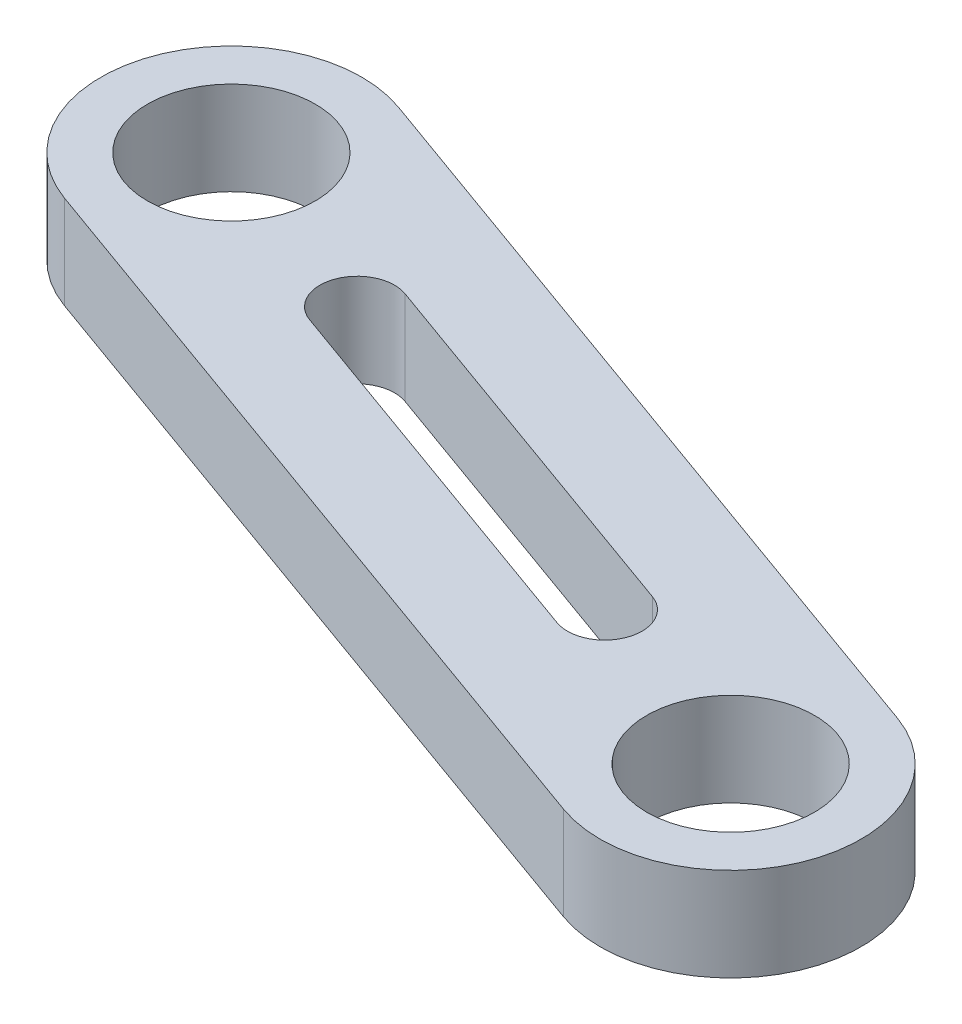
ISO-10303-21;
HEADER;
FILE_DESCRIPTION(('STEP AP214'),'2;1');
FILE_NAME('part.step','',(''),(''),'','','');
FILE_SCHEMA(('AUTOMOTIVE_DESIGN { 1 0 10303 214 1 1 1 1 }'));
ENDSEC;
DATA;
#1=APPLICATION_CONTEXT('core data for automotive mechanical design processes');
#2=APPLICATION_PROTOCOL_DEFINITION('international standard','automotive_design',2000,#1);
#3=PRODUCT_CONTEXT('',#1,'mechanical');
#4=PRODUCT('Part','Part','',(#3));
#5=PRODUCT_RELATED_PRODUCT_CATEGORY('part','',(#4));
#6=PRODUCT_DEFINITION_FORMATION('','',#4);
#7=PRODUCT_DEFINITION_CONTEXT('part definition',#1,'design');
#8=PRODUCT_DEFINITION('design','',#6,#7);
#9=PRODUCT_DEFINITION_SHAPE('','',#8);
#10=(LENGTH_UNIT() NAMED_UNIT(*) SI_UNIT(.MILLI.,.METRE.));
#11=(NAMED_UNIT(*) PLANE_ANGLE_UNIT() SI_UNIT($,.RADIAN.));
#12=(NAMED_UNIT(*) SI_UNIT($,.STERADIAN.) SOLID_ANGLE_UNIT());
#13=UNCERTAINTY_MEASURE_WITH_UNIT(LENGTH_MEASURE(1.E-05),#10,'distance_accuracy_value','');
#14=(GEOMETRIC_REPRESENTATION_CONTEXT(3) GLOBAL_UNCERTAINTY_ASSIGNED_CONTEXT((#13)) GLOBAL_UNIT_ASSIGNED_CONTEXT((#10,
#11,#12)) REPRESENTATION_CONTEXT('',''));
#15=CARTESIAN_POINT('',(0.,0.,0.));
#16=DIRECTION('',(0.,0.,1.));
#17=DIRECTION('',(1.,0.,0.));
#18=AXIS2_PLACEMENT_3D('',#15,#16,#17);
#19=CARTESIAN_POINT('',(-41.7689300556869,5.,100.));
#20=DIRECTION('',(0.,1.,0.));
#21=DIRECTION('',(0.,0.,1.));
#22=AXIS2_PLACEMENT_3D('',#19,#20,#21);
#23=PLANE('',#22);
#24=CARTESIAN_POINT('',(-31.2371314393114,5.,103.782164853996));
#25=DIRECTION('',(0.,1.,0.));
#26=DIRECTION('',(0.,0.,1.));
#27=AXIS2_PLACEMENT_3D('',#24,#25,#26);
#28=CIRCLE('',#27,1.99999999999999);
#29=CARTESIAN_POINT('',(-30.5611614127652,5.,101.899861870093));
#30=VERTEX_POINT('',#29);
#31=CARTESIAN_POINT('',(-31.9131014658576,5.,105.664467837899));
#32=VERTEX_POINT('',#31);
#33=EDGE_CURVE('E51',#30,#32,#28,.T.);
#34=ORIENTED_EDGE('',*,*,#33,.F.);
#35=DIRECTION('',(-0.941151491951632,0.,-0.337985013273099));
#36=VECTOR('',#35,1.);
#37=CARTESIAN_POINT('',(-30.5611614127652,5.,101.899861870093));
#38=LINE('',#37,#36);
#39=CARTESIAN_POINT('',(-9.85582858982932,5.,109.335532162101));
#40=VERTEX_POINT('',#39);
#41=EDGE_CURVE('E119',#40,#30,#38,.T.);
#42=ORIENTED_EDGE('',*,*,#41,.F.);
#43=CARTESIAN_POINT('',(-10.5317986163755,5.,111.217835146004));
#44=DIRECTION('',(0.,1.,0.));
#45=DIRECTION('',(0.,0.,1.));
#46=AXIS2_PLACEMENT_3D('',#43,#44,#45);
#47=CIRCLE('',#46,1.99999999999999);
#48=CARTESIAN_POINT('',(-11.2077686429217,5.,113.100138129907));
#49=VERTEX_POINT('',#48);
#50=EDGE_CURVE('E104',#49,#40,#47,.T.);
#51=ORIENTED_EDGE('',*,*,#50,.F.);
#52=DIRECTION('',(0.941151491951632,0.,0.337985013273099));
#53=VECTOR('',#52,1.);
#54=CARTESIAN_POINT('',(-31.9131014658576,5.,105.664467837899));
#55=LINE('',#54,#53);
#56=EDGE_CURVE('E113',#32,#49,#55,.T.);
#57=ORIENTED_EDGE('',*,*,#56,.F.);
#58=EDGE_LOOP('',(#34,#42,#51,#57));
#59=FACE_BOUND('',#58,.T.);
#60=CARTESIAN_POINT('',(-41.7689300556869,5.,100.));
#61=DIRECTION('',(0.,1.,0.));
#62=DIRECTION('',(0.,0.,1.));
#63=AXIS2_PLACEMENT_3D('',#60,#61,#62);
#64=CIRCLE('',#63,4.5);
#65=CARTESIAN_POINT('',(-41.7689300556869,5.,104.5));
#66=VERTEX_POINT('',#65);
#67=EDGE_CURVE('E135',#66,#66,#64,.T.);
#68=ORIENTED_EDGE('',*,*,#67,.F.);
#69=EDGE_LOOP('',(#68));
#70=FACE_BOUND('',#69,.T.);
#71=CARTESIAN_POINT('',(-41.7689300556869,5.,100.));
#72=DIRECTION('',(0.,1.,0.));
#73=DIRECTION('',(0.,0.,1.));
#74=AXIS2_PLACEMENT_3D('',#71,#72,#73);
#75=CIRCLE('',#74,6.99999999999999);
#76=CARTESIAN_POINT('',(-39.4030349627752,5.,93.4119395563386));
#77=VERTEX_POINT('',#76);
#78=CARTESIAN_POINT('',(-44.1348251485986,5.,106.588060443661));
#79=VERTEX_POINT('',#78);
#80=EDGE_CURVE('E141',#77,#79,#75,.T.);
#81=ORIENTED_EDGE('',*,*,#80,.T.);
#82=DIRECTION('',(0.941151491951632,0.,0.337985013273099));
#83=VECTOR('',#82,1.);
#84=CARTESIAN_POINT('',(-44.1348251485986,5.,106.588060443661));
#85=LINE('',#84,#83);
#86=CARTESIAN_POINT('',(-2.3658950929117,5.,121.588060443661));
#87=VERTEX_POINT('',#86);
#88=EDGE_CURVE('E144',#79,#87,#85,.T.);
#89=ORIENTED_EDGE('',*,*,#88,.T.);
#90=CARTESIAN_POINT('',(0.,5.,115.));
#91=DIRECTION('',(0.,1.,0.));
#92=DIRECTION('',(0.,0.,1.));
#93=AXIS2_PLACEMENT_3D('',#90,#91,#92);
#94=CIRCLE('',#93,7.00000000000001);
#95=CARTESIAN_POINT('',(2.36589509291169,5.,108.411939556339));
#96=VERTEX_POINT('',#95);
#97=EDGE_CURVE('E147',#87,#96,#94,.T.);
#98=ORIENTED_EDGE('',*,*,#97,.T.);
#99=DIRECTION('',(-0.941151491951632,0.,-0.337985013273099));
#100=VECTOR('',#99,1.);
#101=CARTESIAN_POINT('',(-39.4030349627752,5.,93.4119395563386));
#102=LINE('',#101,#100);
#103=EDGE_CURVE('E149',#96,#77,#102,.T.);
#104=ORIENTED_EDGE('',*,*,#103,.T.);
#105=EDGE_LOOP('',(#81,#89,#98,#104));
#106=FACE_BOUND('',#105,.T.);
#107=CARTESIAN_POINT('',(0.,5.,115.));
#108=DIRECTION('',(0.,1.,0.));
#109=DIRECTION('',(0.,0.,1.));
#110=AXIS2_PLACEMENT_3D('',#107,#108,#109);
#111=CIRCLE('',#110,4.5);
#112=CARTESIAN_POINT('',(0.,5.,119.5));
#113=VERTEX_POINT('',#112);
#114=EDGE_CURVE('E129',#113,#113,#111,.T.);
#115=ORIENTED_EDGE('',*,*,#114,.F.);
#116=EDGE_LOOP('',(#115));
#117=FACE_BOUND('',#116,.T.);
#118=ADVANCED_FACE('F36',(#59,#70,#106,#117),#23,.T.);
#119=CARTESIAN_POINT('',(-41.7689300556869,0.,100.));
#120=DIRECTION('',(0.,1.,0.));
#121=DIRECTION('',(0.,0.,1.));
#122=AXIS2_PLACEMENT_3D('',#119,#120,#121);
#123=PLANE('',#122);
#124=DIRECTION('',(-0.941151491951632,0.,-0.337985013273099));
#125=VECTOR('',#124,1.);
#126=CARTESIAN_POINT('',(-41.0929600291407,0.,98.1176970160967));
#127=LINE('',#126,#125);
#128=CARTESIAN_POINT('',(-9.85582858982932,0.,109.335532162101));
#129=VERTEX_POINT('',#128);
#130=CARTESIAN_POINT('',(-30.5611614127652,0.,101.899861870093));
#131=VERTEX_POINT('',#130);
#132=EDGE_CURVE('E44',#129,#131,#127,.T.);
#133=ORIENTED_EDGE('',*,*,#132,.T.);
#134=CARTESIAN_POINT('',(-31.2371314393114,0.,103.782164853996));
#135=DIRECTION('',(0.,1.,0.));
#136=DIRECTION('',(0.,0.,1.));
#137=AXIS2_PLACEMENT_3D('',#134,#135,#136);
#138=CIRCLE('',#137,1.99999999999999);
#139=CARTESIAN_POINT('',(-31.9131014658576,0.,105.664467837899));
#140=VERTEX_POINT('',#139);
#141=EDGE_CURVE('E11',#131,#140,#138,.T.);
#142=ORIENTED_EDGE('',*,*,#141,.T.);
#143=DIRECTION('',(0.941151491951632,0.,0.337985013273099));
#144=VECTOR('',#143,1.);
#145=CARTESIAN_POINT('',(-42.4449000822331,0.,101.882302983903));
#146=LINE('',#145,#144);
#147=CARTESIAN_POINT('',(-11.2077686429217,0.,113.100138129907));
#148=VERTEX_POINT('',#147);
#149=EDGE_CURVE('E170',#140,#148,#146,.T.);
#150=ORIENTED_EDGE('',*,*,#149,.T.);
#151=CARTESIAN_POINT('',(-10.5317986163755,0.,111.217835146004));
#152=DIRECTION('',(0.,1.,0.));
#153=DIRECTION('',(0.,0.,1.));
#154=AXIS2_PLACEMENT_3D('',#151,#152,#153);
#155=CIRCLE('',#154,1.99999999999999);
#156=EDGE_CURVE('E107',#148,#129,#155,.T.);
#157=ORIENTED_EDGE('',*,*,#156,.T.);
#158=EDGE_LOOP('',(#133,#142,#150,#157));
#159=FACE_BOUND('',#158,.T.);
#160=CARTESIAN_POINT('',(-41.7689300556869,0.,100.));
#161=DIRECTION('',(0.,1.,0.));
#162=DIRECTION('',(0.,0.,1.));
#163=AXIS2_PLACEMENT_3D('',#160,#161,#162);
#164=CIRCLE('',#163,6.99999999999999);
#165=CARTESIAN_POINT('',(-39.4030349627752,0.,93.4119395563386));
#166=VERTEX_POINT('',#165);
#167=CARTESIAN_POINT('',(-44.1348251485986,0.,106.588060443661));
#168=VERTEX_POINT('',#167);
#169=EDGE_CURVE('E138',#166,#168,#164,.T.);
#170=ORIENTED_EDGE('',*,*,#169,.F.);
#171=DIRECTION('',(-0.941151491951632,0.,-0.337985013273099));
#172=VECTOR('',#171,1.);
#173=CARTESIAN_POINT('',(-39.4030349627752,0.,93.4119395563386));
#174=LINE('',#173,#172);
#175=CARTESIAN_POINT('',(2.36589509291169,0.,108.411939556339));
#176=VERTEX_POINT('',#175);
#177=EDGE_CURVE('E145',#176,#166,#174,.T.);
#178=ORIENTED_EDGE('',*,*,#177,.F.);
#179=CARTESIAN_POINT('',(0.,0.,115.));
#180=DIRECTION('',(0.,1.,0.));
#181=DIRECTION('',(0.,0.,1.));
#182=AXIS2_PLACEMENT_3D('',#179,#180,#181);
#183=CIRCLE('',#182,7.00000000000001);
#184=CARTESIAN_POINT('',(-2.3658950929117,0.,121.588060443661));
#185=VERTEX_POINT('',#184);
#186=EDGE_CURVE('E156',#185,#176,#183,.T.);
#187=ORIENTED_EDGE('',*,*,#186,.F.);
#188=DIRECTION('',(0.941151491951632,0.,0.337985013273099));
#189=VECTOR('',#188,1.);
#190=CARTESIAN_POINT('',(-44.1348251485986,0.,106.588060443661));
#191=LINE('',#190,#189);
#192=EDGE_CURVE('E154',#168,#185,#191,.T.);
#193=ORIENTED_EDGE('',*,*,#192,.F.);
#194=EDGE_LOOP('',(#170,#178,#187,#193));
#195=FACE_BOUND('',#194,.T.);
#196=CARTESIAN_POINT('',(-41.7689300556869,0.,100.));
#197=DIRECTION('',(0.,1.,0.));
#198=DIRECTION('',(0.,0.,1.));
#199=AXIS2_PLACEMENT_3D('',#196,#197,#198);
#200=CIRCLE('',#199,4.5);
#201=CARTESIAN_POINT('',(-41.7689300556869,0.,104.5));
#202=VERTEX_POINT('',#201);
#203=EDGE_CURVE('E132',#202,#202,#200,.T.);
#204=ORIENTED_EDGE('',*,*,#203,.T.);
#205=EDGE_LOOP('',(#204));
#206=FACE_BOUND('',#205,.T.);
#207=CARTESIAN_POINT('',(0.,0.,115.));
#208=DIRECTION('',(0.,1.,0.));
#209=DIRECTION('',(0.,0.,1.));
#210=AXIS2_PLACEMENT_3D('',#207,#208,#209);
#211=CIRCLE('',#210,4.5);
#212=CARTESIAN_POINT('',(0.,0.,119.5));
#213=VERTEX_POINT('',#212);
#214=EDGE_CURVE('E126',#213,#213,#211,.T.);
#215=ORIENTED_EDGE('',*,*,#214,.T.);
#216=EDGE_LOOP('',(#215));
#217=FACE_BOUND('',#216,.T.);
#218=ADVANCED_FACE('F174',(#159,#195,#206,#217),#123,.F.);
#219=CARTESIAN_POINT('',(-41.7689300556869,5.,100.));
#220=DIRECTION('',(0.,-1.,0.));
#221=DIRECTION('',(0.,0.,-1.));
#222=AXIS2_PLACEMENT_3D('',#219,#220,#221);
#223=CYLINDRICAL_SURFACE('',#222,6.99999999999999);
#224=ORIENTED_EDGE('',*,*,#169,.T.);
#225=DIRECTION('',(0.,-1.,0.));
#226=VECTOR('',#225,1.);
#227=CARTESIAN_POINT('',(-44.1348251485986,5.,106.588060443661));
#228=LINE('',#227,#226);
#229=EDGE_CURVE('E167',#79,#168,#228,.T.);
#230=ORIENTED_EDGE('',*,*,#229,.F.);
#231=ORIENTED_EDGE('',*,*,#80,.F.);
#232=DIRECTION('',(0.,-1.,0.));
#233=VECTOR('',#232,1.);
#234=CARTESIAN_POINT('',(-39.4030349627752,5.,93.4119395563386));
#235=LINE('',#234,#233);
#236=EDGE_CURVE('E151',#77,#166,#235,.T.);
#237=ORIENTED_EDGE('',*,*,#236,.T.);
#238=EDGE_LOOP('',(#224,#230,#231,#237));
#239=FACE_BOUND('',#238,.T.);
#240=ADVANCED_FACE('F38',(#239),#223,.T.);
#241=CARTESIAN_POINT('',(-44.1348251485986,5.,106.588060443661));
#242=DIRECTION('',(0.337985013273099,0.,-0.941151491951632));
#243=DIRECTION('',(-0.941151491951632,0.,-0.337985013273099));
#244=AXIS2_PLACEMENT_3D('',#241,#242,#243);
#245=PLANE('',#244);
#246=ORIENTED_EDGE('',*,*,#192,.T.);
#247=DIRECTION('',(0.,-1.,0.));
#248=VECTOR('',#247,1.);
#249=CARTESIAN_POINT('',(-2.3658950929117,5.,121.588060443661));
#250=LINE('',#249,#248);
#251=EDGE_CURVE('E164',#87,#185,#250,.T.);
#252=ORIENTED_EDGE('',*,*,#251,.F.);
#253=ORIENTED_EDGE('',*,*,#88,.F.);
#254=ORIENTED_EDGE('',*,*,#229,.T.);
#255=EDGE_LOOP('',(#246,#252,#253,#254));
#256=FACE_BOUND('',#255,.T.);
#257=ADVANCED_FACE('F206',(#256),#245,.F.);
#258=CARTESIAN_POINT('',(0.,5.,115.));
#259=DIRECTION('',(0.,-1.,0.));
#260=DIRECTION('',(0.,0.,-1.));
#261=AXIS2_PLACEMENT_3D('',#258,#259,#260);
#262=CYLINDRICAL_SURFACE('',#261,7.00000000000001);
#263=ORIENTED_EDGE('',*,*,#186,.T.);
#264=DIRECTION('',(0.,-1.,0.));
#265=VECTOR('',#264,1.);
#266=CARTESIAN_POINT('',(2.36589509291169,5.,108.411939556339));
#267=LINE('',#266,#265);
#268=EDGE_CURVE('E161',#96,#176,#267,.T.);
#269=ORIENTED_EDGE('',*,*,#268,.F.);
#270=ORIENTED_EDGE('',*,*,#97,.F.);
#271=ORIENTED_EDGE('',*,*,#251,.T.);
#272=EDGE_LOOP('',(#263,#269,#270,#271));
#273=FACE_BOUND('',#272,.T.);
#274=ADVANCED_FACE('F203',(#273),#262,.T.);
#275=CARTESIAN_POINT('',(-39.4030349627752,5.,93.4119395563386));
#276=DIRECTION('',(-0.337985013273099,0.,0.941151491951632));
#277=DIRECTION('',(0.941151491951632,0.,0.337985013273099));
#278=AXIS2_PLACEMENT_3D('',#275,#276,#277);
#279=PLANE('',#278);
#280=ORIENTED_EDGE('',*,*,#177,.T.);
#281=ORIENTED_EDGE('',*,*,#236,.F.);
#282=ORIENTED_EDGE('',*,*,#103,.F.);
#283=ORIENTED_EDGE('',*,*,#268,.T.);
#284=EDGE_LOOP('',(#280,#281,#282,#283));
#285=FACE_BOUND('',#284,.T.);
#286=ADVANCED_FACE('F200',(#285),#279,.F.);
#287=CARTESIAN_POINT('',(-41.7689300556869,5.,100.));
#288=DIRECTION('',(0.,-1.,0.));
#289=DIRECTION('',(0.,0.,-1.));
#290=AXIS2_PLACEMENT_3D('',#287,#288,#289);
#291=CYLINDRICAL_SURFACE('',#290,4.5);
#292=ORIENTED_EDGE('',*,*,#67,.T.);
#293=EDGE_LOOP('',(#292));
#294=FACE_BOUND('',#293,.T.);
#295=ORIENTED_EDGE('',*,*,#203,.F.);
#296=EDGE_LOOP('',(#295));
#297=FACE_BOUND('',#296,.T.);
#298=ADVANCED_FACE('F188',(#294,#297),#291,.F.);
#299=CARTESIAN_POINT('',(0.,5.,115.));
#300=DIRECTION('',(0.,-1.,0.));
#301=DIRECTION('',(0.,0.,-1.));
#302=AXIS2_PLACEMENT_3D('',#299,#300,#301);
#303=CYLINDRICAL_SURFACE('',#302,4.5);
#304=ORIENTED_EDGE('',*,*,#114,.T.);
#305=EDGE_LOOP('',(#304));
#306=FACE_BOUND('',#305,.T.);
#307=ORIENTED_EDGE('',*,*,#214,.F.);
#308=EDGE_LOOP('',(#307));
#309=FACE_BOUND('',#308,.T.);
#310=ADVANCED_FACE('F181',(#306,#309),#303,.F.);
#311=CARTESIAN_POINT('',(-31.2371314393114,-5.,103.782164853996));
#312=DIRECTION('',(0.,1.,0.));
#313=DIRECTION('',(0.,0.,1.));
#314=AXIS2_PLACEMENT_3D('',#311,#312,#313);
#315=CYLINDRICAL_SURFACE('',#314,1.99999999999999);
#316=DIRECTION('',(0.,1.,0.));
#317=VECTOR('',#316,1.);
#318=CARTESIAN_POINT('',(-30.5611614127652,-5.,101.899861870093));
#319=LINE('',#318,#317);
#320=EDGE_CURVE('E124',#131,#30,#319,.T.);
#321=ORIENTED_EDGE('',*,*,#320,.T.);
#322=ORIENTED_EDGE('',*,*,#33,.T.);
#323=DIRECTION('',(0.,1.,0.));
#324=VECTOR('',#323,1.);
#325=CARTESIAN_POINT('',(-31.9131014658576,-5.,105.664467837899));
#326=LINE('',#325,#324);
#327=EDGE_CURVE('E110',#140,#32,#326,.T.);
#328=ORIENTED_EDGE('',*,*,#327,.F.);
#329=ORIENTED_EDGE('',*,*,#141,.F.);
#330=EDGE_LOOP('',(#321,#322,#328,#329));
#331=FACE_BOUND('',#330,.T.);
#332=ADVANCED_FACE('F179',(#331),#315,.F.);
#333=CARTESIAN_POINT('',(-30.5611614127652,-5.,101.899861870093));
#334=DIRECTION('',(0.337985013273099,0.,-0.941151491951632));
#335=DIRECTION('',(-0.941151491951632,0.,-0.337985013273099));
#336=AXIS2_PLACEMENT_3D('',#333,#334,#335);
#337=PLANE('',#336);
#338=DIRECTION('',(0.,1.,0.));
#339=VECTOR('',#338,1.);
#340=CARTESIAN_POINT('',(-9.85582858982932,-5.,109.335532162101));
#341=LINE('',#340,#339);
#342=EDGE_CURVE('E109',#129,#40,#341,.T.);
#343=ORIENTED_EDGE('',*,*,#342,.T.);
#344=ORIENTED_EDGE('',*,*,#41,.T.);
#345=ORIENTED_EDGE('',*,*,#320,.F.);
#346=ORIENTED_EDGE('',*,*,#132,.F.);
#347=EDGE_LOOP('',(#343,#344,#345,#346));
#348=FACE_BOUND('',#347,.T.);
#349=ADVANCED_FACE('F178',(#348),#337,.F.);
#350=CARTESIAN_POINT('',(-10.5317986163755,-5.,111.217835146004));
#351=DIRECTION('',(0.,1.,0.));
#352=DIRECTION('',(0.,0.,1.));
#353=AXIS2_PLACEMENT_3D('',#350,#351,#352);
#354=CYLINDRICAL_SURFACE('',#353,1.99999999999999);
#355=DIRECTION('',(0.,1.,0.));
#356=VECTOR('',#355,1.);
#357=CARTESIAN_POINT('',(-11.2077686429217,-5.,113.100138129907));
#358=LINE('',#357,#356);
#359=EDGE_CURVE('E59',#148,#49,#358,.T.);
#360=ORIENTED_EDGE('',*,*,#359,.T.);
#361=ORIENTED_EDGE('',*,*,#50,.T.);
#362=ORIENTED_EDGE('',*,*,#342,.F.);
#363=ORIENTED_EDGE('',*,*,#156,.F.);
#364=EDGE_LOOP('',(#360,#361,#362,#363));
#365=FACE_BOUND('',#364,.T.);
#366=ADVANCED_FACE('F101',(#365),#354,.F.);
#367=CARTESIAN_POINT('',(-31.9131014658576,-5.,105.664467837899));
#368=DIRECTION('',(-0.337985013273099,0.,0.941151491951632));
#369=DIRECTION('',(0.941151491951632,0.,0.337985013273099));
#370=AXIS2_PLACEMENT_3D('',#367,#368,#369);
#371=PLANE('',#370);
#372=ORIENTED_EDGE('',*,*,#327,.T.);
#373=ORIENTED_EDGE('',*,*,#56,.T.);
#374=ORIENTED_EDGE('',*,*,#359,.F.);
#375=ORIENTED_EDGE('',*,*,#149,.F.);
#376=EDGE_LOOP('',(#372,#373,#374,#375));
#377=FACE_BOUND('',#376,.T.);
#378=ADVANCED_FACE('F114',(#377),#371,.F.);
#379=CLOSED_SHELL('',(#118,#218,#240,#257,#274,#286,#298,#310,#332,#349,#366,#378));
#380=MANIFOLD_SOLID_BREP('B2',#379);
#381=ADVANCED_BREP_SHAPE_REPRESENTATION('',(#18,#380),#14);
#382=SHAPE_DEFINITION_REPRESENTATION(#9,#381);
ENDSEC;
END-ISO-10303-21;
